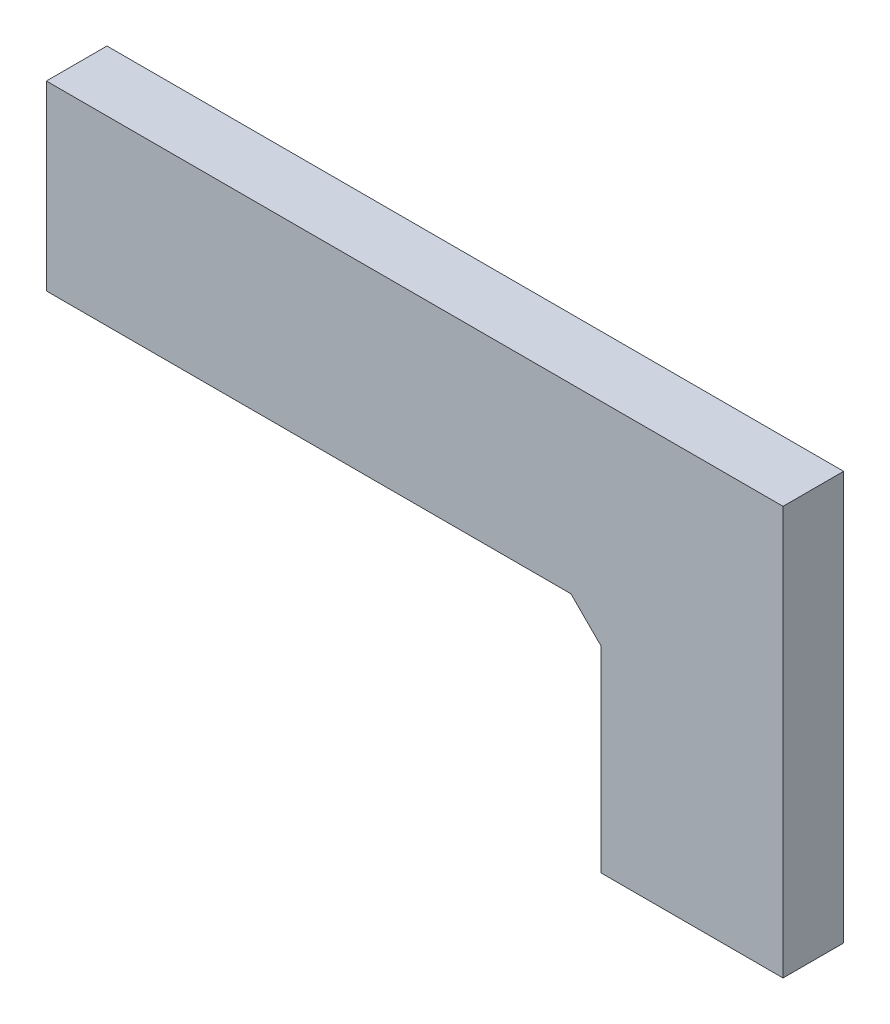
ISO-10303-21;
HEADER;
FILE_DESCRIPTION(('STEP AP214'),'2;1');
FILE_NAME('part.step','',(''),(''),'','','');
FILE_SCHEMA(('AUTOMOTIVE_DESIGN { 1 0 10303 214 1 1 1 1 }'));
ENDSEC;
DATA;
#1=APPLICATION_CONTEXT('core data for automotive mechanical design processes');
#2=APPLICATION_PROTOCOL_DEFINITION('international standard','automotive_design',2000,#1);
#3=PRODUCT_CONTEXT('',#1,'mechanical');
#4=PRODUCT('Part','Part','',(#3));
#5=PRODUCT_RELATED_PRODUCT_CATEGORY('part','',(#4));
#6=PRODUCT_DEFINITION_FORMATION('','',#4);
#7=PRODUCT_DEFINITION_CONTEXT('part definition',#1,'design');
#8=PRODUCT_DEFINITION('design','',#6,#7);
#9=PRODUCT_DEFINITION_SHAPE('','',#8);
#10=(LENGTH_UNIT() NAMED_UNIT(*) SI_UNIT(.MILLI.,.METRE.));
#11=(NAMED_UNIT(*) PLANE_ANGLE_UNIT() SI_UNIT($,.RADIAN.));
#12=(NAMED_UNIT(*) SI_UNIT($,.STERADIAN.) SOLID_ANGLE_UNIT());
#13=UNCERTAINTY_MEASURE_WITH_UNIT(LENGTH_MEASURE(1.E-05),#10,'distance_accuracy_value','');
#14=(GEOMETRIC_REPRESENTATION_CONTEXT(3) GLOBAL_UNCERTAINTY_ASSIGNED_CONTEXT((#13)) GLOBAL_UNIT_ASSIGNED_CONTEXT((#10,
#11,#12)) REPRESENTATION_CONTEXT('',''));
#15=CARTESIAN_POINT('',(0.,0.,0.));
#16=DIRECTION('',(0.,0.,1.));
#17=DIRECTION('',(1.,0.,0.));
#18=AXIS2_PLACEMENT_3D('',#15,#16,#17);
#19=CARTESIAN_POINT('',(0.,0.,0.5));
#20=DIRECTION('',(0.,0.,1.));
#21=DIRECTION('',(1.,0.,0.));
#22=AXIS2_PLACEMENT_3D('',#19,#20,#21);
#23=PLANE('',#22);
#24=DIRECTION('',(0.,-1.,0.));
#25=VECTOR('',#24,1.);
#26=CARTESIAN_POINT('',(26.432499999997,0.,0.5));
#27=LINE('',#26,#25);
#28=CARTESIAN_POINT('',(26.432499999997,-0.621320343563054,0.5));
#29=VERTEX_POINT('',#28);
#30=CARTESIAN_POINT('',(26.432499999997,-2.2413203435652,0.5));
#31=VERTEX_POINT('',#30);
#32=EDGE_CURVE('E11',#29,#31,#27,.T.);
#33=ORIENTED_EDGE('',*,*,#32,.T.);
#34=DIRECTION('',(1.,0.,0.));
#35=VECTOR('',#34,1.);
#36=CARTESIAN_POINT('',(0.,-2.2413203435652,0.5));
#37=LINE('',#36,#35);
#38=CARTESIAN_POINT('',(27.9325000000007,-2.2413203435653,0.5));
#39=VERTEX_POINT('',#38);
#40=EDGE_CURVE('E24',#31,#39,#37,.T.);
#41=ORIENTED_EDGE('',*,*,#40,.T.);
#42=DIRECTION('',(0.,1.,0.));
#43=VECTOR('',#42,1.);
#44=CARTESIAN_POINT('',(27.9325000000007,0.,0.5));
#45=LINE('',#44,#43);
#46=CARTESIAN_POINT('',(27.9325000000007,1.1286796564445,0.5));
#47=VERTEX_POINT('',#46);
#48=EDGE_CURVE('E131',#39,#47,#45,.T.);
#49=ORIENTED_EDGE('',*,*,#48,.T.);
#50=DIRECTION('',(1.,0.,0.));
#51=VECTOR('',#50,1.);
#52=CARTESIAN_POINT('',(0.,1.1286796564445,0.5));
#53=LINE('',#52,#51);
#54=CARTESIAN_POINT('',(21.8550000000007,1.1286796564445,0.5));
#55=VERTEX_POINT('',#54);
#56=EDGE_CURVE('E129',#55,#47,#53,.T.);
#57=ORIENTED_EDGE('',*,*,#56,.F.);
#58=DIRECTION('',(0.,-1.,0.));
#59=VECTOR('',#58,1.);
#60=CARTESIAN_POINT('',(21.8550000000007,0.,0.5));
#61=LINE('',#60,#59);
#62=CARTESIAN_POINT('',(21.8550000000007,-0.37132034356345,0.5));
#63=VERTEX_POINT('',#62);
#64=EDGE_CURVE('E96',#55,#63,#61,.T.);
#65=ORIENTED_EDGE('',*,*,#64,.T.);
#66=DIRECTION('',(1.,0.,0.));
#67=VECTOR('',#66,1.);
#68=CARTESIAN_POINT('',(0.,-0.371320343565212,0.5));
#69=LINE('',#68,#67);
#70=CARTESIAN_POINT('',(26.1824999999971,-0.371320343563101,0.5));
#71=VERTEX_POINT('',#70);
#72=EDGE_CURVE('E126',#63,#71,#69,.T.);
#73=ORIENTED_EDGE('',*,*,#72,.T.);
#74=DIRECTION('',(0.707106781186542,-0.707106781186554,0.));
#75=VECTOR('',#74,1.);
#76=CARTESIAN_POINT('',(12.9055898282172,12.905589828217,0.5));
#77=LINE('',#76,#75);
#78=EDGE_CURVE('E124',#71,#29,#77,.T.);
#79=ORIENTED_EDGE('',*,*,#78,.T.);
#80=EDGE_LOOP('',(#33,#41,#49,#57,#65,#73,#79));
#81=FACE_BOUND('',#80,.T.);
#82=ADVANCED_FACE('F17',(#81),#23,.T.);
#83=CARTESIAN_POINT('',(27.9325000000007,0.,0.5));
#84=DIRECTION('',(-1.,0.,0.));
#85=DIRECTION('',(0.,0.,1.));
#86=AXIS2_PLACEMENT_3D('',#83,#84,#85);
#87=PLANE('',#86);
#88=DIRECTION('',(0.,0.,1.));
#89=VECTOR('',#88,1.);
#90=CARTESIAN_POINT('',(27.9325000000007,-2.2413203435653,0.5));
#91=LINE('',#90,#89);
#92=CARTESIAN_POINT('',(27.9325000000007,-2.2413203435652,0.));
#93=VERTEX_POINT('',#92);
#94=EDGE_CURVE('E121',#93,#39,#91,.T.);
#95=ORIENTED_EDGE('',*,*,#94,.F.);
#96=DIRECTION('',(0.,1.,0.));
#97=VECTOR('',#96,1.);
#98=CARTESIAN_POINT('',(27.9325000000007,0.,0.));
#99=LINE('',#98,#97);
#100=CARTESIAN_POINT('',(27.9325000000007,1.1286796564445,0.));
#101=VERTEX_POINT('',#100);
#102=EDGE_CURVE('E119',#93,#101,#99,.T.);
#103=ORIENTED_EDGE('',*,*,#102,.T.);
#104=DIRECTION('',(0.,0.,-1.));
#105=VECTOR('',#104,1.);
#106=CARTESIAN_POINT('',(27.9325000000007,1.1286796564445,0.5));
#107=LINE('',#106,#105);
#108=EDGE_CURVE('E91',#47,#101,#107,.T.);
#109=ORIENTED_EDGE('',*,*,#108,.F.);
#110=ORIENTED_EDGE('',*,*,#48,.F.);
#111=EDGE_LOOP('',(#95,#103,#109,#110));
#112=FACE_BOUND('',#111,.T.);
#113=ADVANCED_FACE('F135',(#112),#87,.F.);
#114=CARTESIAN_POINT('',(0.,0.,0.));
#115=DIRECTION('',(0.,0.,1.));
#116=DIRECTION('',(1.,0.,0.));
#117=AXIS2_PLACEMENT_3D('',#114,#115,#116);
#118=PLANE('',#117);
#119=DIRECTION('',(1.,0.,0.));
#120=VECTOR('',#119,1.);
#121=CARTESIAN_POINT('',(0.,-2.2413203435652,0.));
#122=LINE('',#121,#120);
#123=CARTESIAN_POINT('',(26.432499999997,-2.2413203435652,0.));
#124=VERTEX_POINT('',#123);
#125=EDGE_CURVE('E115',#124,#93,#122,.T.);
#126=ORIENTED_EDGE('',*,*,#125,.F.);
#127=DIRECTION('',(0.,-1.,0.));
#128=VECTOR('',#127,1.);
#129=CARTESIAN_POINT('',(26.432499999997,0.,0.));
#130=LINE('',#129,#128);
#131=CARTESIAN_POINT('',(26.432499999997,-0.621320343563054,0.));
#132=VERTEX_POINT('',#131);
#133=EDGE_CURVE('E112',#132,#124,#130,.T.);
#134=ORIENTED_EDGE('',*,*,#133,.F.);
#135=DIRECTION('',(0.707106781186542,-0.707106781186554,0.));
#136=VECTOR('',#135,1.);
#137=CARTESIAN_POINT('',(12.9055898282172,12.905589828217,0.));
#138=LINE('',#137,#136);
#139=CARTESIAN_POINT('',(26.1824999999971,-0.371320343563101,0.));
#140=VERTEX_POINT('',#139);
#141=EDGE_CURVE('E109',#140,#132,#138,.T.);
#142=ORIENTED_EDGE('',*,*,#141,.F.);
#143=DIRECTION('',(1.,0.,0.));
#144=VECTOR('',#143,1.);
#145=CARTESIAN_POINT('',(0.,-0.371320343565212,0.));
#146=LINE('',#145,#144);
#147=CARTESIAN_POINT('',(21.8550000000007,-0.37132034356345,0.));
#148=VERTEX_POINT('',#147);
#149=EDGE_CURVE('E78',#148,#140,#146,.T.);
#150=ORIENTED_EDGE('',*,*,#149,.F.);
#151=DIRECTION('',(0.,-1.,0.));
#152=VECTOR('',#151,1.);
#153=CARTESIAN_POINT('',(21.8550000000007,0.,0.));
#154=LINE('',#153,#152);
#155=CARTESIAN_POINT('',(21.8550000000007,1.1286796564445,0.));
#156=VERTEX_POINT('',#155);
#157=EDGE_CURVE('E72',#156,#148,#154,.T.);
#158=ORIENTED_EDGE('',*,*,#157,.F.);
#159=DIRECTION('',(1.,0.,0.));
#160=VECTOR('',#159,1.);
#161=CARTESIAN_POINT('',(0.,1.1286796564445,0.));
#162=LINE('',#161,#160);
#163=EDGE_CURVE('E76',#156,#101,#162,.T.);
#164=ORIENTED_EDGE('',*,*,#163,.T.);
#165=ORIENTED_EDGE('',*,*,#102,.F.);
#166=EDGE_LOOP('',(#126,#134,#142,#150,#158,#164,#165));
#167=FACE_BOUND('',#166,.T.);
#168=ADVANCED_FACE('F74',(#167),#118,.F.);
#169=CARTESIAN_POINT('',(26.432499999997,0.,0.5));
#170=DIRECTION('',(1.,0.,0.));
#171=DIRECTION('',(0.,1.,0.));
#172=AXIS2_PLACEMENT_3D('',#169,#170,#171);
#173=PLANE('',#172);
#174=DIRECTION('',(0.,0.,-1.));
#175=VECTOR('',#174,1.);
#176=CARTESIAN_POINT('',(26.432499999997,-2.2413203435652,0.5));
#177=LINE('',#176,#175);
#178=EDGE_CURVE('E92',#31,#124,#177,.T.);
#179=ORIENTED_EDGE('',*,*,#178,.F.);
#180=ORIENTED_EDGE('',*,*,#32,.F.);
#181=DIRECTION('',(0.,0.,-1.));
#182=VECTOR('',#181,1.);
#183=CARTESIAN_POINT('',(26.432499999997,-0.621320343563054,0.5));
#184=LINE('',#183,#182);
#185=EDGE_CURVE('E104',#29,#132,#184,.T.);
#186=ORIENTED_EDGE('',*,*,#185,.T.);
#187=ORIENTED_EDGE('',*,*,#133,.T.);
#188=EDGE_LOOP('',(#179,#180,#186,#187));
#189=FACE_BOUND('',#188,.T.);
#190=ADVANCED_FACE('F137',(#189),#173,.F.);
#191=CARTESIAN_POINT('',(12.9055898282172,12.905589828217,0.5));
#192=DIRECTION('',(0.707106781186554,0.707106781186542,0.));
#193=DIRECTION('',(-0.707106781186542,0.707106781186554,0.));
#194=AXIS2_PLACEMENT_3D('',#191,#192,#193);
#195=PLANE('',#194);
#196=ORIENTED_EDGE('',*,*,#141,.T.);
#197=ORIENTED_EDGE('',*,*,#185,.F.);
#198=ORIENTED_EDGE('',*,*,#78,.F.);
#199=DIRECTION('',(0.,0.,-1.));
#200=VECTOR('',#199,1.);
#201=CARTESIAN_POINT('',(26.1824999999971,-0.371320343563101,0.5));
#202=LINE('',#201,#200);
#203=EDGE_CURVE('E99',#71,#140,#202,.T.);
#204=ORIENTED_EDGE('',*,*,#203,.T.);
#205=EDGE_LOOP('',(#196,#197,#198,#204));
#206=FACE_BOUND('',#205,.T.);
#207=ADVANCED_FACE('F141',(#206),#195,.F.);
#208=CARTESIAN_POINT('',(0.,-0.371320343565212,0.5));
#209=DIRECTION('',(0.,1.,0.));
#210=DIRECTION('',(-1.,0.,0.));
#211=AXIS2_PLACEMENT_3D('',#208,#209,#210);
#212=PLANE('',#211);
#213=ORIENTED_EDGE('',*,*,#149,.T.);
#214=ORIENTED_EDGE('',*,*,#203,.F.);
#215=ORIENTED_EDGE('',*,*,#72,.F.);
#216=DIRECTION('',(0.,0.,-1.));
#217=VECTOR('',#216,1.);
#218=CARTESIAN_POINT('',(21.8550000000007,-0.37132034356345,0.5));
#219=LINE('',#218,#217);
#220=EDGE_CURVE('E97',#63,#148,#219,.T.);
#221=ORIENTED_EDGE('',*,*,#220,.T.);
#222=EDGE_LOOP('',(#213,#214,#215,#221));
#223=FACE_BOUND('',#222,.T.);
#224=ADVANCED_FACE('F144',(#223),#212,.F.);
#225=CARTESIAN_POINT('',(21.8550000000007,0.,0.5));
#226=DIRECTION('',(1.,0.,0.));
#227=DIRECTION('',(0.,0.,-1.));
#228=AXIS2_PLACEMENT_3D('',#225,#226,#227);
#229=PLANE('',#228);
#230=ORIENTED_EDGE('',*,*,#157,.T.);
#231=ORIENTED_EDGE('',*,*,#220,.F.);
#232=ORIENTED_EDGE('',*,*,#64,.F.);
#233=DIRECTION('',(0.,0.,-1.));
#234=VECTOR('',#233,1.);
#235=CARTESIAN_POINT('',(21.8550000000007,1.1286796564445,0.5));
#236=LINE('',#235,#234);
#237=EDGE_CURVE('E89',#55,#156,#236,.T.);
#238=ORIENTED_EDGE('',*,*,#237,.T.);
#239=EDGE_LOOP('',(#230,#231,#232,#238));
#240=FACE_BOUND('',#239,.T.);
#241=ADVANCED_FACE('F95',(#240),#229,.F.);
#242=CARTESIAN_POINT('',(0.,1.1286796564445,0.5));
#243=DIRECTION('',(0.,1.,0.));
#244=DIRECTION('',(0.,0.,1.));
#245=AXIS2_PLACEMENT_3D('',#242,#243,#244);
#246=PLANE('',#245);
#247=ORIENTED_EDGE('',*,*,#163,.F.);
#248=ORIENTED_EDGE('',*,*,#237,.F.);
#249=ORIENTED_EDGE('',*,*,#56,.T.);
#250=ORIENTED_EDGE('',*,*,#108,.T.);
#251=EDGE_LOOP('',(#247,#248,#249,#250));
#252=FACE_BOUND('',#251,.T.);
#253=ADVANCED_FACE('F87',(#252),#246,.T.);
#254=CARTESIAN_POINT('',(3.88578058618805E-13,-2.2413203435652,-0.01));
#255=DIRECTION('',(0.,-1.,0.));
#256=DIRECTION('',(1.,0.,0.));
#257=AXIS2_PLACEMENT_3D('',#254,#255,#256);
#258=PLANE('',#257);
#259=ORIENTED_EDGE('',*,*,#40,.F.);
#260=ORIENTED_EDGE('',*,*,#178,.T.);
#261=ORIENTED_EDGE('',*,*,#125,.T.);
#262=ORIENTED_EDGE('',*,*,#94,.T.);
#263=EDGE_LOOP('',(#259,#260,#261,#262));
#264=FACE_BOUND('',#263,.T.);
#265=ADVANCED_FACE('F136',(#264),#258,.T.);
#266=CLOSED_SHELL('',(#82,#113,#168,#190,#207,#224,#241,#253,#265));
#267=MANIFOLD_SOLID_BREP('B1',#266);
#268=ADVANCED_BREP_SHAPE_REPRESENTATION('',(#18,#267),#14);
#269=SHAPE_DEFINITION_REPRESENTATION(#9,#268);
ENDSEC;
END-ISO-10303-21;
